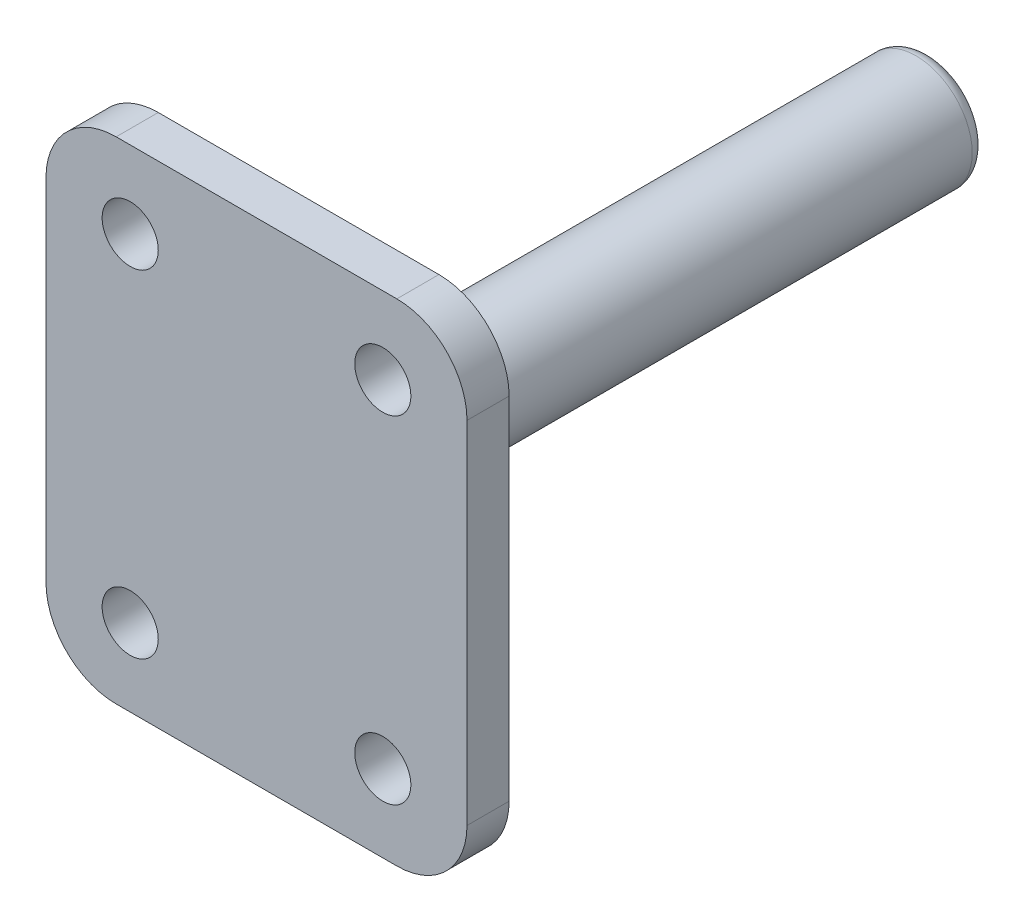
ISO-10303-21;
HEADER;
FILE_DESCRIPTION(('STEP AP214'),'2;1');
FILE_NAME('part.step','',(''),(''),'','','');
FILE_SCHEMA(('AUTOMOTIVE_DESIGN { 1 0 10303 214 1 1 1 1 }'));
ENDSEC;
DATA;
#1=APPLICATION_CONTEXT('core data for automotive mechanical design processes');
#2=APPLICATION_PROTOCOL_DEFINITION('international standard','automotive_design',2000,#1);
#3=PRODUCT_CONTEXT('',#1,'mechanical');
#4=PRODUCT('Part','Part','',(#3));
#5=PRODUCT_RELATED_PRODUCT_CATEGORY('part','',(#4));
#6=PRODUCT_DEFINITION_FORMATION('','',#4);
#7=PRODUCT_DEFINITION_CONTEXT('part definition',#1,'design');
#8=PRODUCT_DEFINITION('design','',#6,#7);
#9=PRODUCT_DEFINITION_SHAPE('','',#8);
#10=(LENGTH_UNIT() NAMED_UNIT(*) SI_UNIT(.MILLI.,.METRE.));
#11=(NAMED_UNIT(*) PLANE_ANGLE_UNIT() SI_UNIT($,.RADIAN.));
#12=(NAMED_UNIT(*) SI_UNIT($,.STERADIAN.) SOLID_ANGLE_UNIT());
#13=UNCERTAINTY_MEASURE_WITH_UNIT(LENGTH_MEASURE(1.E-05),#10,'distance_accuracy_value','');
#14=(GEOMETRIC_REPRESENTATION_CONTEXT(3) GLOBAL_UNCERTAINTY_ASSIGNED_CONTEXT((#13)) GLOBAL_UNIT_ASSIGNED_CONTEXT((#10,
#11,#12)) REPRESENTATION_CONTEXT('',''));
#15=CARTESIAN_POINT('',(0.,0.,0.));
#16=DIRECTION('',(0.,0.,1.));
#17=DIRECTION('',(1.,0.,0.));
#18=AXIS2_PLACEMENT_3D('',#15,#16,#17);
#19=CARTESIAN_POINT('',(0.,0.,3.));
#20=DIRECTION('',(1.,0.,0.));
#21=DIRECTION('',(0.,1.,0.));
#22=AXIS2_PLACEMENT_3D('',#19,#20,#21);
#23=PLANE('',#22);
#24=DIRECTION('',(0.,-1.,0.));
#25=VECTOR('',#24,1.);
#26=CARTESIAN_POINT('',(0.,0.,0.));
#27=LINE('',#26,#25);
#28=CARTESIAN_POINT('',(0.,-5.,0.));
#29=VERTEX_POINT('',#28);
#30=CARTESIAN_POINT('',(0.,-30.,0.));
#31=VERTEX_POINT('',#30);
#32=EDGE_CURVE('E128',#29,#31,#27,.T.);
#33=ORIENTED_EDGE('',*,*,#32,.T.);
#34=DIRECTION('',(0.,0.,-1.));
#35=VECTOR('',#34,1.);
#36=CARTESIAN_POINT('',(0.,-30.,3.));
#37=LINE('',#36,#35);
#38=CARTESIAN_POINT('',(0.,-30.,3.));
#39=VERTEX_POINT('',#38);
#40=EDGE_CURVE('E106',#31,#39,#37,.F.);
#41=ORIENTED_EDGE('',*,*,#40,.T.);
#42=DIRECTION('',(0.,-1.,0.));
#43=VECTOR('',#42,1.);
#44=CARTESIAN_POINT('',(0.,0.,3.));
#45=LINE('',#44,#43);
#46=CARTESIAN_POINT('',(0.,-5.,3.));
#47=VERTEX_POINT('',#46);
#48=EDGE_CURVE('E138',#47,#39,#45,.T.);
#49=ORIENTED_EDGE('',*,*,#48,.F.);
#50=DIRECTION('',(0.,0.,-1.));
#51=VECTOR('',#50,1.);
#52=CARTESIAN_POINT('',(0.,-5.,3.));
#53=LINE('',#52,#51);
#54=EDGE_CURVE('E111',#47,#29,#53,.T.);
#55=ORIENTED_EDGE('',*,*,#54,.T.);
#56=EDGE_LOOP('',(#33,#41,#49,#55));
#57=FACE_BOUND('',#56,.T.);
#58=ADVANCED_FACE('F34',(#57),#23,.F.);
#59=CARTESIAN_POINT('',(0.,-35.,3.));
#60=DIRECTION('',(0.,1.,0.));
#61=DIRECTION('',(0.,0.,1.));
#62=AXIS2_PLACEMENT_3D('',#59,#60,#61);
#63=PLANE('',#62);
#64=DIRECTION('',(1.,0.,0.));
#65=VECTOR('',#64,1.);
#66=CARTESIAN_POINT('',(0.,-35.,3.));
#67=LINE('',#66,#65);
#68=CARTESIAN_POINT('',(5.,-35.,3.));
#69=VERTEX_POINT('',#68);
#70=CARTESIAN_POINT('',(25.,-35.,3.));
#71=VERTEX_POINT('',#70);
#72=EDGE_CURVE('E121',#69,#71,#67,.T.);
#73=ORIENTED_EDGE('',*,*,#72,.F.);
#74=DIRECTION('',(0.,0.,-1.));
#75=VECTOR('',#74,1.);
#76=CARTESIAN_POINT('',(5.,-35.,3.));
#77=LINE('',#76,#75);
#78=CARTESIAN_POINT('',(5.,-35.,0.));
#79=VERTEX_POINT('',#78);
#80=EDGE_CURVE('E105',#69,#79,#77,.T.);
#81=ORIENTED_EDGE('',*,*,#80,.T.);
#82=DIRECTION('',(1.,0.,0.));
#83=VECTOR('',#82,1.);
#84=CARTESIAN_POINT('',(0.,-35.,0.));
#85=LINE('',#84,#83);
#86=CARTESIAN_POINT('',(25.,-35.,0.));
#87=VERTEX_POINT('',#86);
#88=EDGE_CURVE('E118',#79,#87,#85,.T.);
#89=ORIENTED_EDGE('',*,*,#88,.T.);
#90=DIRECTION('',(0.,0.,-1.));
#91=VECTOR('',#90,1.);
#92=CARTESIAN_POINT('',(25.,-35.,3.));
#93=LINE('',#92,#91);
#94=EDGE_CURVE('E123',#87,#71,#93,.F.);
#95=ORIENTED_EDGE('',*,*,#94,.T.);
#96=EDGE_LOOP('',(#73,#81,#89,#95));
#97=FACE_BOUND('',#96,.T.);
#98=ADVANCED_FACE('F117',(#97),#63,.F.);
#99=CARTESIAN_POINT('',(30.,0.,3.));
#100=DIRECTION('',(-1.,0.,0.));
#101=DIRECTION('',(0.,0.,1.));
#102=AXIS2_PLACEMENT_3D('',#99,#100,#101);
#103=PLANE('',#102);
#104=DIRECTION('',(0.,1.,0.));
#105=VECTOR('',#104,1.);
#106=CARTESIAN_POINT('',(30.,0.,3.));
#107=LINE('',#106,#105);
#108=CARTESIAN_POINT('',(30.,-30.,3.));
#109=VERTEX_POINT('',#108);
#110=CARTESIAN_POINT('',(30.,-5.00000000000001,3.));
#111=VERTEX_POINT('',#110);
#112=EDGE_CURVE('E226',#109,#111,#107,.T.);
#113=ORIENTED_EDGE('',*,*,#112,.F.);
#114=DIRECTION('',(0.,0.,-1.));
#115=VECTOR('',#114,1.);
#116=CARTESIAN_POINT('',(30.,-30.,3.));
#117=LINE('',#116,#115);
#118=CARTESIAN_POINT('',(30.,-30.,0.));
#119=VERTEX_POINT('',#118);
#120=EDGE_CURVE('E157',#109,#119,#117,.T.);
#121=ORIENTED_EDGE('',*,*,#120,.T.);
#122=DIRECTION('',(0.,1.,0.));
#123=VECTOR('',#122,1.);
#124=CARTESIAN_POINT('',(30.,0.,0.));
#125=LINE('',#124,#123);
#126=CARTESIAN_POINT('',(30.,-5.00000000000001,0.));
#127=VERTEX_POINT('',#126);
#128=EDGE_CURVE('E127',#119,#127,#125,.T.);
#129=ORIENTED_EDGE('',*,*,#128,.T.);
#130=DIRECTION('',(0.,0.,-1.));
#131=VECTOR('',#130,1.);
#132=CARTESIAN_POINT('',(30.,-5.00000000000001,3.));
#133=LINE('',#132,#131);
#134=EDGE_CURVE('E155',#127,#111,#133,.F.);
#135=ORIENTED_EDGE('',*,*,#134,.T.);
#136=EDGE_LOOP('',(#113,#121,#129,#135));
#137=FACE_BOUND('',#136,.T.);
#138=ADVANCED_FACE('F197',(#137),#103,.F.);
#139=CARTESIAN_POINT('',(0.,0.,3.));
#140=DIRECTION('',(0.,-1.,0.));
#141=DIRECTION('',(1.,0.,0.));
#142=AXIS2_PLACEMENT_3D('',#139,#140,#141);
#143=PLANE('',#142);
#144=DIRECTION('',(-1.,0.,0.));
#145=VECTOR('',#144,1.);
#146=CARTESIAN_POINT('',(0.,0.,3.));
#147=LINE('',#146,#145);
#148=CARTESIAN_POINT('',(25.,0.,3.));
#149=VERTEX_POINT('',#148);
#150=CARTESIAN_POINT('',(5.,0.,3.));
#151=VERTEX_POINT('',#150);
#152=EDGE_CURVE('E139',#149,#151,#147,.T.);
#153=ORIENTED_EDGE('',*,*,#152,.F.);
#154=DIRECTION('',(0.,0.,-1.));
#155=VECTOR('',#154,1.);
#156=CARTESIAN_POINT('',(25.,0.,3.));
#157=LINE('',#156,#155);
#158=CARTESIAN_POINT('',(25.,0.,0.));
#159=VERTEX_POINT('',#158);
#160=EDGE_CURVE('E161',#149,#159,#157,.T.);
#161=ORIENTED_EDGE('',*,*,#160,.T.);
#162=DIRECTION('',(-1.,0.,0.));
#163=VECTOR('',#162,1.);
#164=CARTESIAN_POINT('',(0.,0.,0.));
#165=LINE('',#164,#163);
#166=CARTESIAN_POINT('',(5.,0.,0.));
#167=VERTEX_POINT('',#166);
#168=EDGE_CURVE('E131',#159,#167,#165,.T.);
#169=ORIENTED_EDGE('',*,*,#168,.T.);
#170=DIRECTION('',(0.,0.,-1.));
#171=VECTOR('',#170,1.);
#172=CARTESIAN_POINT('',(5.,0.,3.));
#173=LINE('',#172,#171);
#174=EDGE_CURVE('E49',#167,#151,#173,.F.);
#175=ORIENTED_EDGE('',*,*,#174,.T.);
#176=EDGE_LOOP('',(#153,#161,#169,#175));
#177=FACE_BOUND('',#176,.T.);
#178=ADVANCED_FACE('F238',(#177),#143,.F.);
#179=CARTESIAN_POINT('',(0.,0.,3.));
#180=DIRECTION('',(0.,0.,1.));
#181=DIRECTION('',(1.,0.,0.));
#182=AXIS2_PLACEMENT_3D('',#179,#180,#181);
#183=PLANE('',#182);
#184=CARTESIAN_POINT('',(24.,-5.50000000000001,3.));
#185=DIRECTION('',(0.,0.,1.));
#186=DIRECTION('',(1.,0.,0.));
#187=AXIS2_PLACEMENT_3D('',#184,#185,#186);
#188=CIRCLE('',#187,2.);
#189=CARTESIAN_POINT('',(26.,-5.50000000000001,3.));
#190=VERTEX_POINT('',#189);
#191=EDGE_CURVE('E379',#190,#190,#188,.T.);
#192=ORIENTED_EDGE('',*,*,#191,.F.);
#193=EDGE_LOOP('',(#192));
#194=FACE_BOUND('',#193,.T.);
#195=CARTESIAN_POINT('',(6.,-29.5,3.));
#196=DIRECTION('',(0.,0.,1.));
#197=DIRECTION('',(1.,0.,0.));
#198=AXIS2_PLACEMENT_3D('',#195,#196,#197);
#199=CIRCLE('',#198,2.);
#200=CARTESIAN_POINT('',(8.,-29.5,3.));
#201=VERTEX_POINT('',#200);
#202=EDGE_CURVE('E376',#201,#201,#199,.T.);
#203=ORIENTED_EDGE('',*,*,#202,.F.);
#204=EDGE_LOOP('',(#203));
#205=FACE_BOUND('',#204,.T.);
#206=CARTESIAN_POINT('',(24.,-29.5,3.));
#207=DIRECTION('',(0.,0.,1.));
#208=DIRECTION('',(1.,0.,0.));
#209=AXIS2_PLACEMENT_3D('',#206,#207,#208);
#210=CIRCLE('',#209,2.00000000000001);
#211=CARTESIAN_POINT('',(26.,-29.5,3.));
#212=VERTEX_POINT('',#211);
#213=EDGE_CURVE('E374',#212,#212,#210,.T.);
#214=ORIENTED_EDGE('',*,*,#213,.F.);
#215=EDGE_LOOP('',(#214));
#216=FACE_BOUND('',#215,.T.);
#217=CARTESIAN_POINT('',(6.,-5.50000000000001,3.));
#218=DIRECTION('',(0.,0.,1.));
#219=DIRECTION('',(1.,0.,0.));
#220=AXIS2_PLACEMENT_3D('',#217,#218,#219);
#221=CIRCLE('',#220,2.);
#222=CARTESIAN_POINT('',(8.,-5.50000000000001,3.));
#223=VERTEX_POINT('',#222);
#224=EDGE_CURVE('E169',#223,#223,#221,.T.);
#225=ORIENTED_EDGE('',*,*,#224,.F.);
#226=EDGE_LOOP('',(#225));
#227=FACE_BOUND('',#226,.T.);
#228=ORIENTED_EDGE('',*,*,#48,.T.);
#229=CARTESIAN_POINT('',(5.,-30.,3.));
#230=DIRECTION('',(0.,0.,1.));
#231=DIRECTION('',(1.,0.,0.));
#232=AXIS2_PLACEMENT_3D('',#229,#230,#231);
#233=CIRCLE('',#232,5.);
#234=EDGE_CURVE('E153',#39,#69,#233,.T.);
#235=ORIENTED_EDGE('',*,*,#234,.T.);
#236=ORIENTED_EDGE('',*,*,#72,.T.);
#237=CARTESIAN_POINT('',(25.,-30.,3.));
#238=DIRECTION('',(0.,0.,1.));
#239=DIRECTION('',(1.,0.,0.));
#240=AXIS2_PLACEMENT_3D('',#237,#238,#239);
#241=CIRCLE('',#240,5.);
#242=EDGE_CURVE('E151',#71,#109,#241,.T.);
#243=ORIENTED_EDGE('',*,*,#242,.T.);
#244=ORIENTED_EDGE('',*,*,#112,.T.);
#245=CARTESIAN_POINT('',(25.,-5.00000000000001,3.));
#246=DIRECTION('',(0.,0.,1.));
#247=DIRECTION('',(1.,0.,0.));
#248=AXIS2_PLACEMENT_3D('',#245,#246,#247);
#249=CIRCLE('',#248,5.);
#250=EDGE_CURVE('E56',#111,#149,#249,.T.);
#251=ORIENTED_EDGE('',*,*,#250,.T.);
#252=ORIENTED_EDGE('',*,*,#152,.T.);
#253=CARTESIAN_POINT('',(5.,-5.,3.));
#254=DIRECTION('',(0.,0.,1.));
#255=DIRECTION('',(1.,0.,0.));
#256=AXIS2_PLACEMENT_3D('',#253,#254,#255);
#257=CIRCLE('',#256,5.);
#258=EDGE_CURVE('E148',#151,#47,#257,.T.);
#259=ORIENTED_EDGE('',*,*,#258,.T.);
#260=EDGE_LOOP('',(#228,#235,#236,#243,#244,#251,#252,#259));
#261=FACE_BOUND('',#260,.T.);
#262=ADVANCED_FACE('F224',(#194,#205,#216,#227,#261),#183,.T.);
#263=CARTESIAN_POINT('',(0.,0.,0.));
#264=DIRECTION('',(0.,0.,1.));
#265=DIRECTION('',(1.,0.,0.));
#266=AXIS2_PLACEMENT_3D('',#263,#264,#265);
#267=PLANE('',#266);
#268=CARTESIAN_POINT('',(15.,-17.5,0.));
#269=DIRECTION('',(0.,0.,1.));
#270=DIRECTION('',(1.,0.,0.));
#271=AXIS2_PLACEMENT_3D('',#268,#269,#270);
#272=CIRCLE('',#271,4.);
#273=CARTESIAN_POINT('',(19.,-17.5,0.));
#274=VERTEX_POINT('',#273);
#275=EDGE_CURVE('E164',#274,#274,#272,.F.);
#276=ORIENTED_EDGE('',*,*,#275,.F.);
#277=EDGE_LOOP('',(#276));
#278=FACE_BOUND('',#277,.T.);
#279=CARTESIAN_POINT('',(24.,-5.50000000000001,0.));
#280=DIRECTION('',(0.,0.,1.));
#281=DIRECTION('',(1.,0.,0.));
#282=AXIS2_PLACEMENT_3D('',#279,#280,#281);
#283=CIRCLE('',#282,2.);
#284=CARTESIAN_POINT('',(26.,-5.50000000000001,0.));
#285=VERTEX_POINT('',#284);
#286=EDGE_CURVE('E133',#285,#285,#283,.T.);
#287=ORIENTED_EDGE('',*,*,#286,.T.);
#288=EDGE_LOOP('',(#287));
#289=FACE_BOUND('',#288,.T.);
#290=CARTESIAN_POINT('',(6.,-29.5,0.));
#291=DIRECTION('',(0.,0.,1.));
#292=DIRECTION('',(1.,0.,0.));
#293=AXIS2_PLACEMENT_3D('',#290,#291,#292);
#294=CIRCLE('',#293,2.);
#295=CARTESIAN_POINT('',(8.,-29.5,0.));
#296=VERTEX_POINT('',#295);
#297=EDGE_CURVE('E172',#296,#296,#294,.T.);
#298=ORIENTED_EDGE('',*,*,#297,.T.);
#299=EDGE_LOOP('',(#298));
#300=FACE_BOUND('',#299,.T.);
#301=CARTESIAN_POINT('',(24.,-29.5,0.));
#302=DIRECTION('',(0.,0.,1.));
#303=DIRECTION('',(1.,0.,0.));
#304=AXIS2_PLACEMENT_3D('',#301,#302,#303);
#305=CIRCLE('',#304,2.00000000000001);
#306=CARTESIAN_POINT('',(26.,-29.5,0.));
#307=VERTEX_POINT('',#306);
#308=EDGE_CURVE('E168',#307,#307,#305,.T.);
#309=ORIENTED_EDGE('',*,*,#308,.T.);
#310=EDGE_LOOP('',(#309));
#311=FACE_BOUND('',#310,.T.);
#312=CARTESIAN_POINT('',(6.,-5.50000000000001,0.));
#313=DIRECTION('',(0.,0.,1.));
#314=DIRECTION('',(1.,0.,0.));
#315=AXIS2_PLACEMENT_3D('',#312,#313,#314);
#316=CIRCLE('',#315,2.);
#317=CARTESIAN_POINT('',(8.,-5.50000000000001,0.));
#318=VERTEX_POINT('',#317);
#319=EDGE_CURVE('E165',#318,#318,#316,.T.);
#320=ORIENTED_EDGE('',*,*,#319,.T.);
#321=EDGE_LOOP('',(#320));
#322=FACE_BOUND('',#321,.T.);
#323=ORIENTED_EDGE('',*,*,#88,.F.);
#324=CARTESIAN_POINT('',(5.,-30.,0.));
#325=DIRECTION('',(0.,0.,1.));
#326=DIRECTION('',(1.,0.,0.));
#327=AXIS2_PLACEMENT_3D('',#324,#325,#326);
#328=CIRCLE('',#327,5.);
#329=EDGE_CURVE('E101',#79,#31,#328,.F.);
#330=ORIENTED_EDGE('',*,*,#329,.T.);
#331=ORIENTED_EDGE('',*,*,#32,.F.);
#332=CARTESIAN_POINT('',(5.,-5.,0.));
#333=DIRECTION('',(0.,0.,1.));
#334=DIRECTION('',(1.,0.,0.));
#335=AXIS2_PLACEMENT_3D('',#332,#333,#334);
#336=CIRCLE('',#335,5.);
#337=EDGE_CURVE('E122',#29,#167,#336,.F.);
#338=ORIENTED_EDGE('',*,*,#337,.T.);
#339=ORIENTED_EDGE('',*,*,#168,.F.);
#340=CARTESIAN_POINT('',(25.,-5.00000000000001,0.));
#341=DIRECTION('',(0.,0.,1.));
#342=DIRECTION('',(1.,0.,0.));
#343=AXIS2_PLACEMENT_3D('',#340,#341,#342);
#344=CIRCLE('',#343,5.);
#345=EDGE_CURVE('E142',#159,#127,#344,.F.);
#346=ORIENTED_EDGE('',*,*,#345,.T.);
#347=ORIENTED_EDGE('',*,*,#128,.F.);
#348=CARTESIAN_POINT('',(25.,-30.,0.));
#349=DIRECTION('',(0.,0.,1.));
#350=DIRECTION('',(1.,0.,0.));
#351=AXIS2_PLACEMENT_3D('',#348,#349,#350);
#352=CIRCLE('',#351,5.);
#353=EDGE_CURVE('E112',#119,#87,#352,.F.);
#354=ORIENTED_EDGE('',*,*,#353,.T.);
#355=EDGE_LOOP('',(#323,#330,#331,#338,#339,#346,#347,#354));
#356=FACE_BOUND('',#355,.T.);
#357=ADVANCED_FACE('F125',(#278,#289,#300,#311,#322,#356),#267,.F.);
#358=CARTESIAN_POINT('',(5.,-30.,3.));
#359=DIRECTION('',(0.,0.,-1.));
#360=DIRECTION('',(-1.,0.,0.));
#361=AXIS2_PLACEMENT_3D('',#358,#359,#360);
#362=CYLINDRICAL_SURFACE('',#361,5.);
#363=ORIENTED_EDGE('',*,*,#234,.F.);
#364=ORIENTED_EDGE('',*,*,#40,.F.);
#365=ORIENTED_EDGE('',*,*,#329,.F.);
#366=ORIENTED_EDGE('',*,*,#80,.F.);
#367=EDGE_LOOP('',(#363,#364,#365,#366));
#368=FACE_BOUND('',#367,.T.);
#369=ADVANCED_FACE('F104',(#368),#362,.T.);
#370=CARTESIAN_POINT('',(25.,-30.,3.));
#371=DIRECTION('',(0.,0.,-1.));
#372=DIRECTION('',(-1.,0.,0.));
#373=AXIS2_PLACEMENT_3D('',#370,#371,#372);
#374=CYLINDRICAL_SURFACE('',#373,5.);
#375=ORIENTED_EDGE('',*,*,#242,.F.);
#376=ORIENTED_EDGE('',*,*,#94,.F.);
#377=ORIENTED_EDGE('',*,*,#353,.F.);
#378=ORIENTED_EDGE('',*,*,#120,.F.);
#379=EDGE_LOOP('',(#375,#376,#377,#378));
#380=FACE_BOUND('',#379,.T.);
#381=ADVANCED_FACE('F203',(#380),#374,.T.);
#382=CARTESIAN_POINT('',(25.,-5.00000000000001,3.));
#383=DIRECTION('',(0.,0.,-1.));
#384=DIRECTION('',(-1.,0.,0.));
#385=AXIS2_PLACEMENT_3D('',#382,#383,#384);
#386=CYLINDRICAL_SURFACE('',#385,5.);
#387=ORIENTED_EDGE('',*,*,#250,.F.);
#388=ORIENTED_EDGE('',*,*,#134,.F.);
#389=ORIENTED_EDGE('',*,*,#345,.F.);
#390=ORIENTED_EDGE('',*,*,#160,.F.);
#391=EDGE_LOOP('',(#387,#388,#389,#390));
#392=FACE_BOUND('',#391,.T.);
#393=ADVANCED_FACE('F206',(#392),#386,.T.);
#394=CARTESIAN_POINT('',(5.,-5.,3.));
#395=DIRECTION('',(0.,0.,-1.));
#396=DIRECTION('',(-1.,0.,0.));
#397=AXIS2_PLACEMENT_3D('',#394,#395,#396);
#398=CYLINDRICAL_SURFACE('',#397,5.);
#399=ORIENTED_EDGE('',*,*,#258,.F.);
#400=ORIENTED_EDGE('',*,*,#174,.F.);
#401=ORIENTED_EDGE('',*,*,#337,.F.);
#402=ORIENTED_EDGE('',*,*,#54,.F.);
#403=EDGE_LOOP('',(#399,#400,#401,#402));
#404=FACE_BOUND('',#403,.T.);
#405=ADVANCED_FACE('F209',(#404),#398,.T.);
#406=CARTESIAN_POINT('',(6.,-5.50000000000001,-7.));
#407=DIRECTION('',(0.,0.,1.));
#408=DIRECTION('',(1.,0.,0.));
#409=AXIS2_PLACEMENT_3D('',#406,#407,#408);
#410=CYLINDRICAL_SURFACE('',#409,2.);
#411=ORIENTED_EDGE('',*,*,#224,.T.);
#412=EDGE_LOOP('',(#411));
#413=FACE_BOUND('',#412,.T.);
#414=ORIENTED_EDGE('',*,*,#319,.F.);
#415=EDGE_LOOP('',(#414));
#416=FACE_BOUND('',#415,.T.);
#417=ADVANCED_FACE('F212',(#413,#416),#410,.F.);
#418=CARTESIAN_POINT('',(24.,-29.5,-7.));
#419=DIRECTION('',(0.,0.,1.));
#420=DIRECTION('',(1.,0.,0.));
#421=AXIS2_PLACEMENT_3D('',#418,#419,#420);
#422=CYLINDRICAL_SURFACE('',#421,2.00000000000001);
#423=ORIENTED_EDGE('',*,*,#213,.T.);
#424=EDGE_LOOP('',(#423));
#425=FACE_BOUND('',#424,.T.);
#426=ORIENTED_EDGE('',*,*,#308,.F.);
#427=EDGE_LOOP('',(#426));
#428=FACE_BOUND('',#427,.T.);
#429=ADVANCED_FACE('F217',(#425,#428),#422,.F.);
#430=CARTESIAN_POINT('',(6.,-29.5,-7.));
#431=DIRECTION('',(0.,0.,1.));
#432=DIRECTION('',(1.,0.,0.));
#433=AXIS2_PLACEMENT_3D('',#430,#431,#432);
#434=CYLINDRICAL_SURFACE('',#433,2.);
#435=ORIENTED_EDGE('',*,*,#202,.T.);
#436=EDGE_LOOP('',(#435));
#437=FACE_BOUND('',#436,.T.);
#438=ORIENTED_EDGE('',*,*,#297,.F.);
#439=EDGE_LOOP('',(#438));
#440=FACE_BOUND('',#439,.T.);
#441=ADVANCED_FACE('F251',(#437,#440),#434,.F.);
#442=CARTESIAN_POINT('',(24.,-5.50000000000001,-7.));
#443=DIRECTION('',(0.,0.,1.));
#444=DIRECTION('',(1.,0.,0.));
#445=AXIS2_PLACEMENT_3D('',#442,#443,#444);
#446=CYLINDRICAL_SURFACE('',#445,2.);
#447=ORIENTED_EDGE('',*,*,#191,.T.);
#448=EDGE_LOOP('',(#447));
#449=FACE_BOUND('',#448,.T.);
#450=ORIENTED_EDGE('',*,*,#286,.F.);
#451=EDGE_LOOP('',(#450));
#452=FACE_BOUND('',#451,.T.);
#453=ADVANCED_FACE('F254',(#449,#452),#446,.F.);
#454=CARTESIAN_POINT('',(15.,-17.5,-45.));
#455=DIRECTION('',(0.,0.,1.));
#456=DIRECTION('',(1.,0.,0.));
#457=AXIS2_PLACEMENT_3D('',#454,#455,#456);
#458=CYLINDRICAL_SURFACE('',#457,4.);
#459=CARTESIAN_POINT('',(15.,-17.5,-44.));
#460=DIRECTION('',(0.,0.,-1.));
#461=DIRECTION('',(-1.,0.,0.));
#462=AXIS2_PLACEMENT_3D('',#459,#460,#461);
#463=CIRCLE('',#462,4.);
#464=CARTESIAN_POINT('',(19.,-17.5,-44.));
#465=VERTEX_POINT('',#464);
#466=EDGE_CURVE('E11',#465,#465,#463,.F.);
#467=CARTESIAN_POINT('',(19.,-17.5,-44.));
#468=CARTESIAN_POINT('',(19.,-17.5,-43.5416666666667));
#469=CARTESIAN_POINT('',(19.,-17.5,-43.0833333333333));
#470=CARTESIAN_POINT('',(19.,-17.5,-42.1666666666667));
#471=CARTESIAN_POINT('',(19.,-17.5,-41.7083333333333));
#472=CARTESIAN_POINT('',(19.,-17.5,-40.7916666666667));
#473=CARTESIAN_POINT('',(19.,-17.5,-40.3333333333333));
#474=CARTESIAN_POINT('',(19.,-17.5,-39.4166666666667));
#475=CARTESIAN_POINT('',(19.,-17.5,-38.9583333333333));
#476=CARTESIAN_POINT('',(19.,-17.5,-38.0416666666667));
#477=CARTESIAN_POINT('',(19.,-17.5,-37.5833333333333));
#478=CARTESIAN_POINT('',(19.,-17.5,-36.6666666666667));
#479=CARTESIAN_POINT('',(19.,-17.5,-36.2083333333333));
#480=CARTESIAN_POINT('',(19.,-17.5,-35.2916666666667));
#481=CARTESIAN_POINT('',(19.,-17.5,-34.8333333333333));
#482=CARTESIAN_POINT('',(19.,-17.5,-33.9166666666667));
#483=CARTESIAN_POINT('',(19.,-17.5,-33.4583333333333));
#484=CARTESIAN_POINT('',(19.,-17.5,-32.5416666666667));
#485=CARTESIAN_POINT('',(19.,-17.5,-32.0833333333333));
#486=CARTESIAN_POINT('',(19.,-17.5,-31.1666666666667));
#487=CARTESIAN_POINT('',(19.,-17.5,-30.7083333333333));
#488=CARTESIAN_POINT('',(19.,-17.5,-29.7916666666667));
#489=CARTESIAN_POINT('',(19.,-17.5,-29.3333333333333));
#490=CARTESIAN_POINT('',(19.,-17.5,-28.4166666666667));
#491=CARTESIAN_POINT('',(19.,-17.5,-27.9583333333333));
#492=CARTESIAN_POINT('',(19.,-17.5,-27.0416666666667));
#493=CARTESIAN_POINT('',(19.,-17.5,-26.5833333333333));
#494=CARTESIAN_POINT('',(19.,-17.5,-25.6666666666667));
#495=CARTESIAN_POINT('',(19.,-17.5,-25.2083333333333));
#496=CARTESIAN_POINT('',(19.,-17.5,-24.2916666666667));
#497=CARTESIAN_POINT('',(19.,-17.5,-23.8333333333333));
#498=CARTESIAN_POINT('',(19.,-17.5,-22.9166666666667));
#499=CARTESIAN_POINT('',(19.,-17.5,-22.4583333333333));
#500=CARTESIAN_POINT('',(19.,-17.5,-21.5416666666667));
#501=CARTESIAN_POINT('',(19.,-17.5,-21.0833333333333));
#502=CARTESIAN_POINT('',(19.,-17.5,-20.1666666666667));
#503=CARTESIAN_POINT('',(19.,-17.5,-19.7083333333333));
#504=CARTESIAN_POINT('',(19.,-17.5,-18.7916666666667));
#505=CARTESIAN_POINT('',(19.,-17.5,-18.3333333333333));
#506=CARTESIAN_POINT('',(19.,-17.5,-17.4166666666667));
#507=CARTESIAN_POINT('',(19.,-17.5,-16.9583333333333));
#508=CARTESIAN_POINT('',(19.,-17.5,-16.0416666666667));
#509=CARTESIAN_POINT('',(19.,-17.5,-15.5833333333333));
#510=CARTESIAN_POINT('',(19.,-17.5,-14.6666666666667));
#511=CARTESIAN_POINT('',(19.,-17.5,-14.2083333333333));
#512=CARTESIAN_POINT('',(19.,-17.5,-13.2916666666667));
#513=CARTESIAN_POINT('',(19.,-17.5,-12.8333333333333));
#514=CARTESIAN_POINT('',(19.,-17.5,-11.9166666666667));
#515=CARTESIAN_POINT('',(19.,-17.5,-11.4583333333333));
#516=CARTESIAN_POINT('',(19.,-17.5,-10.5416666666667));
#517=CARTESIAN_POINT('',(19.,-17.5,-10.0833333333333));
#518=CARTESIAN_POINT('',(19.,-17.5,-9.16666666666667));
#519=CARTESIAN_POINT('',(19.,-17.5,-8.70833333333334));
#520=CARTESIAN_POINT('',(19.,-17.5,-7.79166666666667));
#521=CARTESIAN_POINT('',(19.,-17.5,-7.33333333333334));
#522=CARTESIAN_POINT('',(19.,-17.5,-6.41666666666667));
#523=CARTESIAN_POINT('',(19.,-17.5,-5.95833333333334));
#524=CARTESIAN_POINT('',(19.,-17.5,-5.04166666666667));
#525=CARTESIAN_POINT('',(19.,-17.5,-4.58333333333334));
#526=CARTESIAN_POINT('',(19.,-17.5,-3.66666666666667));
#527=CARTESIAN_POINT('',(19.,-17.5,-3.20833333333334));
#528=CARTESIAN_POINT('',(19.,-17.5,-2.29166666666668));
#529=CARTESIAN_POINT('',(19.,-17.5,-1.83333333333334));
#530=CARTESIAN_POINT('',(19.,-17.5,-0.916666666666675));
#531=CARTESIAN_POINT('',(19.,-17.5,-0.458333333333341));
#532=CARTESIAN_POINT('',(19.,-17.5,0.));
#533=B_SPLINE_CURVE_WITH_KNOTS('',3,(#467,#468,#469,#470,#471,#472,#473,#474,#475,#476,#477,
#478,#479,#480,#481,#482,#483,#484,#485,#486,#487,#488,#489,#490,#491,#492,#493,#494,#495,#496,
#497,#498,#499,#500,#501,#502,#503,#504,#505,#506,#507,#508,#509,#510,#511,#512,#513,#514,#515,
#516,#517,#518,#519,#520,#521,#522,#523,#524,#525,#526,#527,#528,#529,#530,#531,#532),
.UNSPECIFIED.,.F.,.F.,(4,2,2,2,2,2,2,2,2,2,2,2,2,2,2,2,2,2,2,2,2,2,2,2,2,2,2,2,2,2,2,2,4),(0.,
1.37499999999999,2.75,4.125,5.5,6.87499999999999,8.24999999999999,9.62499999999999,11.,12.375,
13.75,15.125,16.5,17.875,19.25,20.625,22.,23.375,24.75,26.125,27.5,28.875,30.25,31.625,33.,
34.375,35.75,37.125,38.5,39.875,41.25,42.625,44.),.UNSPECIFIED.);
#534=EDGE_CURVE('BSEAM188',#465,#274,#533,.T.);
#535=ORIENTED_EDGE('',*,*,#466,.T.);
#536=ORIENTED_EDGE('',*,*,#275,.T.);
#537=ORIENTED_EDGE('',*,*,#534,.T.);
#538=ORIENTED_EDGE('',*,*,#534,.F.);
#539=EDGE_LOOP('',(#535,#537,#536,#538));
#540=FACE_BOUND('',#539,.T.);
#541=ADVANCED_FACE('F188',(#540),#458,.T.);
#542=CARTESIAN_POINT('',(15.,-17.5,-45.));
#543=DIRECTION('',(0.,0.,-1.));
#544=DIRECTION('',(-1.,0.,0.));
#545=AXIS2_PLACEMENT_3D('',#542,#543,#544);
#546=PLANE('',#545);
#547=CARTESIAN_POINT('',(15.,-17.5,-45.));
#548=DIRECTION('',(0.,0.,-1.));
#549=DIRECTION('',(-1.,0.,0.));
#550=AXIS2_PLACEMENT_3D('',#547,#548,#549);
#551=CIRCLE('',#550,3.);
#552=CARTESIAN_POINT('',(12.,-17.5,-45.));
#553=VERTEX_POINT('',#552);
#554=EDGE_CURVE('E42',#553,#553,#551,.T.);
#555=ORIENTED_EDGE('',*,*,#554,.T.);
#556=EDGE_LOOP('',(#555));
#557=FACE_BOUND('',#556,.T.);
#558=ADVANCED_FACE('F181',(#557),#546,.T.);
#559=CARTESIAN_POINT('',(15.,-17.5,-44.));
#560=DIRECTION('',(0.,0.,-1.));
#561=DIRECTION('',(-1.,0.,0.));
#562=AXIS2_PLACEMENT_3D('',#559,#560,#561);
#563=TOROIDAL_SURFACE('',#562,3.,1.);
#564=ORIENTED_EDGE('',*,*,#466,.F.);
#565=EDGE_LOOP('',(#564));
#566=FACE_BOUND('',#565,.T.);
#567=ORIENTED_EDGE('',*,*,#554,.F.);
#568=EDGE_LOOP('',(#567));
#569=FACE_BOUND('',#568,.T.);
#570=ADVANCED_FACE('F36',(#566,#569),#563,.T.);
#571=CLOSED_SHELL('',(#58,#98,#138,#178,#262,#357,#369,#381,#393,#405,#417,#429,#441,#453,#541,
#558,#570));
#572=MANIFOLD_SOLID_BREP('B2',#571);
#573=ADVANCED_BREP_SHAPE_REPRESENTATION('',(#18,#572),#14);
#574=SHAPE_DEFINITION_REPRESENTATION(#9,#573);
ENDSEC;
END-ISO-10303-21;
